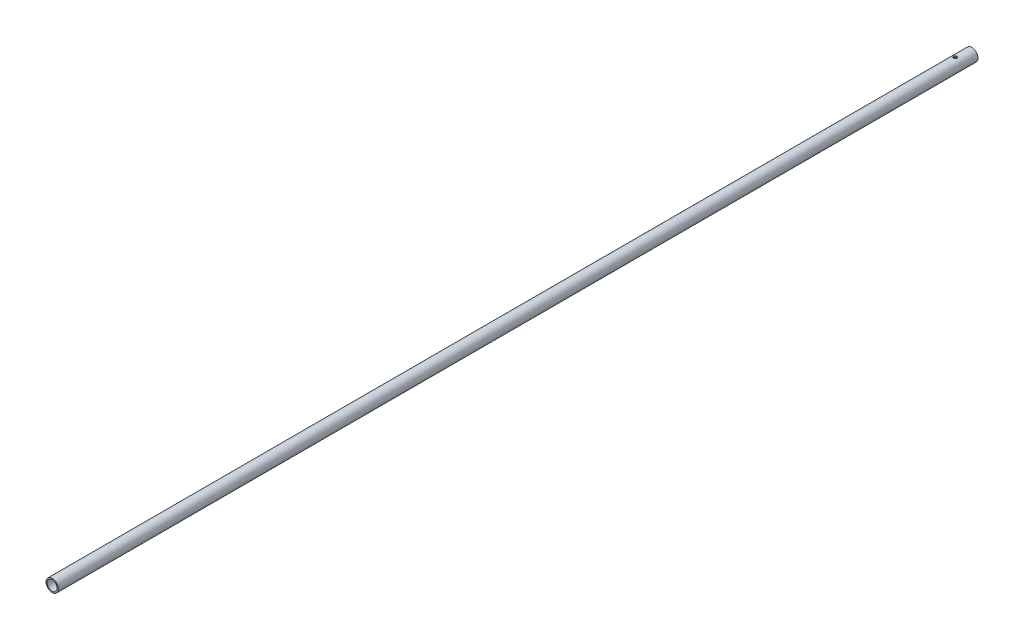
ISO-10303-21;
HEADER;
FILE_DESCRIPTION(('STEP AP214'),'2;1');
FILE_NAME('part.step','',(''),(''),'','','');
FILE_SCHEMA(('AUTOMOTIVE_DESIGN { 1 0 10303 214 1 1 1 1 }'));
ENDSEC;
DATA;
#1=APPLICATION_CONTEXT('core data for automotive mechanical design processes');
#2=APPLICATION_PROTOCOL_DEFINITION('international standard','automotive_design',2000,#1);
#3=PRODUCT_CONTEXT('',#1,'mechanical');
#4=PRODUCT('Part','Part','',(#3));
#5=PRODUCT_RELATED_PRODUCT_CATEGORY('part','',(#4));
#6=PRODUCT_DEFINITION_FORMATION('','',#4);
#7=PRODUCT_DEFINITION_CONTEXT('part definition',#1,'design');
#8=PRODUCT_DEFINITION('design','',#6,#7);
#9=PRODUCT_DEFINITION_SHAPE('','',#8);
#10=(LENGTH_UNIT() NAMED_UNIT(*) SI_UNIT(.MILLI.,.METRE.));
#11=(NAMED_UNIT(*) PLANE_ANGLE_UNIT() SI_UNIT($,.RADIAN.));
#12=(NAMED_UNIT(*) SI_UNIT($,.STERADIAN.) SOLID_ANGLE_UNIT());
#13=UNCERTAINTY_MEASURE_WITH_UNIT(LENGTH_MEASURE(1.E-05),#10,'distance_accuracy_value','');
#14=(GEOMETRIC_REPRESENTATION_CONTEXT(3) GLOBAL_UNCERTAINTY_ASSIGNED_CONTEXT((#13)) GLOBAL_UNIT_ASSIGNED_CONTEXT((#10,
#11,#12)) REPRESENTATION_CONTEXT('',''));
#15=CARTESIAN_POINT('',(0.,0.,0.));
#16=DIRECTION('',(0.,0.,1.));
#17=DIRECTION('',(1.,0.,0.));
#18=AXIS2_PLACEMENT_3D('',#15,#16,#17);
#19=CARTESIAN_POINT('',(0.,0.,558.8));
#20=DIRECTION('',(0.,0.,1.));
#21=DIRECTION('',(1.,0.,0.));
#22=AXIS2_PLACEMENT_3D('',#19,#20,#21);
#23=PLANE('',#22);
#24=CARTESIAN_POINT('',(0.,0.,558.8));
#25=DIRECTION('',(0.,0.,1.));
#26=DIRECTION('',(1.,0.,0.));
#27=AXIS2_PLACEMENT_3D('',#24,#25,#26);
#28=CIRCLE('',#27,3.7592);
#29=CARTESIAN_POINT('',(3.7592,0.,558.8));
#30=VERTEX_POINT('',#29);
#31=EDGE_CURVE('E10',#30,#30,#28,.T.);
#32=ORIENTED_EDGE('',*,*,#31,.T.);
#33=EDGE_LOOP('',(#32));
#34=FACE_BOUND('',#33,.T.);
#35=CARTESIAN_POINT('',(0.,0.,558.8));
#36=DIRECTION('',(0.,0.,1.));
#37=DIRECTION('',(1.,0.,0.));
#38=AXIS2_PLACEMENT_3D('',#35,#36,#37);
#39=CIRCLE('',#38,3.048);
#40=CARTESIAN_POINT('',(3.048,0.,558.8));
#41=VERTEX_POINT('',#40);
#42=EDGE_CURVE('E49',#41,#41,#39,.T.);
#43=ORIENTED_EDGE('',*,*,#42,.F.);
#44=EDGE_LOOP('',(#43));
#45=FACE_BOUND('',#44,.T.);
#46=ADVANCED_FACE('F32',(#34,#45),#23,.T.);
#47=CARTESIAN_POINT('',(0.,0.,0.));
#48=DIRECTION('',(0.,0.,1.));
#49=DIRECTION('',(1.,0.,0.));
#50=AXIS2_PLACEMENT_3D('',#47,#48,#49);
#51=PLANE('',#50);
#52=CARTESIAN_POINT('',(0.,0.,0.));
#53=DIRECTION('',(0.,0.,1.));
#54=DIRECTION('',(1.,0.,0.));
#55=AXIS2_PLACEMENT_3D('',#52,#53,#54);
#56=CIRCLE('',#55,3.7592);
#57=CARTESIAN_POINT('',(3.7592,0.,0.));
#58=VERTEX_POINT('',#57);
#59=EDGE_CURVE('E44',#58,#58,#56,.T.);
#60=ORIENTED_EDGE('',*,*,#59,.F.);
#61=EDGE_LOOP('',(#60));
#62=FACE_BOUND('',#61,.T.);
#63=CARTESIAN_POINT('',(0.,0.,0.));
#64=DIRECTION('',(0.,0.,1.));
#65=DIRECTION('',(1.,0.,0.));
#66=AXIS2_PLACEMENT_3D('',#63,#64,#65);
#67=CIRCLE('',#66,3.048);
#68=CARTESIAN_POINT('',(3.048,0.,0.));
#69=VERTEX_POINT('',#68);
#70=EDGE_CURVE('E52',#69,#69,#67,.T.);
#71=ORIENTED_EDGE('',*,*,#70,.T.);
#72=EDGE_LOOP('',(#71));
#73=FACE_BOUND('',#72,.T.);
#74=ADVANCED_FACE('F103',(#62,#73),#51,.F.);
#75=CARTESIAN_POINT('',(0.,0.,558.8));
#76=DIRECTION('',(0.,0.,-1.));
#77=DIRECTION('',(-1.,0.,0.));
#78=AXIS2_PLACEMENT_3D('',#75,#76,#77);
#79=CYLINDRICAL_SURFACE('',#78,3.7592);
#80=CARTESIAN_POINT('',(0.,-3.7592,11.176));
#81=CARTESIAN_POINT('',(-0.055981236537999,-3.75919918459358,11.1759987302058));
#82=CARTESIAN_POINT('',(-0.111975966663057,-3.75793723752587,11.1713576840597));
#83=CARTESIAN_POINT('',(-0.222350551239019,-3.75302570635412,11.1529501221138));
#84=CARTESIAN_POINT('',(-0.276729647185963,-3.7493750187443,11.1391793887126));
#85=CARTESIAN_POINT('',(-0.382263937320672,-3.74008864799323,11.1029942403726));
#86=CARTESIAN_POINT('',(-0.433423249592395,-3.7344555637542,11.0805911387505));
#87=CARTESIAN_POINT('',(-0.531258572775888,-3.72179869306041,11.0278196031624));
#88=CARTESIAN_POINT('',(-0.577934252422427,-3.7147748039657,10.9974505812661));
#89=CARTESIAN_POINT('',(-0.666586464597382,-3.69990710084376,10.9288475177812));
#90=CARTESIAN_POINT('',(-0.708441284490966,-3.69204897451998,10.890459292945));
#91=CARTESIAN_POINT('',(-0.78520421892341,-3.6764896642834,10.8072370125901));
#92=CARTESIAN_POINT('',(-0.820111413146418,-3.66878850128383,10.7624021044659));
#93=CARTESIAN_POINT('',(-0.88258643458332,-3.65426817166658,10.6665816695557));
#94=CARTESIAN_POINT('',(-0.910013368423057,-3.64746703588247,10.6155012962732));
#95=CARTESIAN_POINT('',(-0.955841492406535,-3.63572760673628,10.5092406741372));
#96=CARTESIAN_POINT('',(-0.974244397263731,-3.63078895951206,10.4540612064751));
#97=CARTESIAN_POINT('',(-1.00107769578693,-3.62348158996868,10.3425187366869));
#98=CARTESIAN_POINT('',(-1.00972915859465,-3.62105600315438,10.2862127331933));
#99=CARTESIAN_POINT('',(-1.01750333065012,-3.61887956381147,10.1729002965618));
#100=CARTESIAN_POINT('',(-1.01662787293595,-3.61912819674645,10.1158940002727));
#101=CARTESIAN_POINT('',(-1.00554836762721,-3.62222126178157,10.0045318773362));
#102=CARTESIAN_POINT('',(-0.995612761546391,-3.62499099246598,9.95014693705533));
#103=CARTESIAN_POINT('',(-0.967125325284436,-3.63269443532542,9.84384621638498));
#104=CARTESIAN_POINT('',(-0.948572789792825,-3.63762832463871,9.7919306385006));
#105=CARTESIAN_POINT('',(-0.903161597565696,-3.64916921080514,9.69134708207385));
#106=CARTESIAN_POINT('',(-0.876209566697004,-3.65579485671458,9.64272349008686));
#107=CARTESIAN_POINT('',(-0.814829563328908,-3.66996279833399,9.55059525008809));
#108=CARTESIAN_POINT('',(-0.780400083193257,-3.67750527876493,9.50709163712045));
#109=CARTESIAN_POINT('',(-0.703673983133144,-3.69296717341038,9.42490563926336));
#110=CARTESIAN_POINT('',(-0.661152200636483,-3.70089074452404,9.38643393805576));
#111=CARTESIAN_POINT('',(-0.570163403782982,-3.71599542438007,9.31712370840479));
#112=CARTESIAN_POINT('',(-0.521696142451035,-3.72317650225642,9.28628549721718));
#113=CARTESIAN_POINT('',(-0.419860142806302,-3.73603326449054,9.23302135263665));
#114=CARTESIAN_POINT('',(-0.366470058875214,-3.74170193398508,9.2106344257161));
#115=CARTESIAN_POINT('',(-0.25649571502604,-3.75084450946339,9.17521520646203));
#116=CARTESIAN_POINT('',(-0.199912175802817,-3.75431890850678,9.16218081249469));
#117=CARTESIAN_POINT('',(-0.0869544099686766,-3.75860655224015,9.14616949808162));
#118=CARTESIAN_POINT('',(-0.0306235848601433,-3.75949553932608,9.14290623477879));
#119=CARTESIAN_POINT('',(0.0817807641836961,-3.75873041519249,9.14573782813204));
#120=CARTESIAN_POINT('',(0.137854314856597,-3.75707657453267,9.15183168917951));
#121=CARTESIAN_POINT('',(0.247124350408283,-3.75146062225681,9.17296998072428));
#122=CARTESIAN_POINT('',(0.300354207740429,-3.74753992679453,9.18785391578566));
#123=CARTESIAN_POINT('',(0.403555769322896,-3.73783576886523,9.22596279176762));
#124=CARTESIAN_POINT('',(0.453527114981151,-3.73205210179687,9.24918864887422));
#125=CARTESIAN_POINT('',(0.549899746962868,-3.71908701315947,9.3038479264627));
#126=CARTESIAN_POINT('',(0.596209736414399,-3.71187996941981,9.33543608648639));
#127=CARTESIAN_POINT('',(0.682971949357936,-3.69690081938352,9.40572946516984));
#128=CARTESIAN_POINT('',(0.72342298023362,-3.68912859852493,9.44443612920261));
#129=CARTESIAN_POINT('',(0.798531413525871,-3.67361509832816,9.52920529933542));
#130=CARTESIAN_POINT('',(0.832986565583012,-3.66588126550813,9.57544870801438));
#131=CARTESIAN_POINT('',(0.893653131776007,-3.65156732786377,9.67322531192282));
#132=CARTESIAN_POINT('',(0.919864881886327,-3.64498717602396,9.72475829145288));
#133=CARTESIAN_POINT('',(0.963103749968263,-3.63380171154526,9.83140059016736));
#134=CARTESIAN_POINT('',(0.980183439919998,-3.62918512709987,9.8864873470279));
#135=CARTESIAN_POINT('',(1.00479357694007,-3.62244950359569,9.99889760081478));
#136=CARTESIAN_POINT('',(1.01232654574886,-3.62032980500172,10.0562205029439));
#137=CARTESIAN_POINT('',(1.01748148630745,-3.61888410126251,10.1694022584618));
#138=CARTESIAN_POINT('',(1.01542896653059,-3.61946633821143,10.2252453331702));
#139=CARTESIAN_POINT('',(1.00222851810503,-3.62314347093249,10.3357573114387));
#140=CARTESIAN_POINT('',(0.991080835716672,-3.62623829867378,10.3904262467485));
#141=CARTESIAN_POINT('',(0.960197567364567,-3.6345365373973,10.4966158861889));
#142=CARTESIAN_POINT('',(0.940532727089865,-3.639722554458,10.5481586207124));
#143=CARTESIAN_POINT('',(0.893228205610188,-3.65161884500594,10.6472526209846));
#144=CARTESIAN_POINT('',(0.865587242600697,-3.6583293634516,10.6948032435931));
#145=CARTESIAN_POINT('',(0.80213609548457,-3.6727713850916,10.7861125981675));
#146=CARTESIAN_POINT('',(0.76610463515918,-3.68052758048504,10.8297136771453));
#147=CARTESIAN_POINT('',(0.687313790569808,-3.69605112772039,10.9103563493302));
#148=CARTESIAN_POINT('',(0.644552762864312,-3.70381848182706,10.9473963355303));
#149=CARTESIAN_POINT('',(0.552373591230194,-3.71869502650103,11.0146733487932));
#150=CARTESIAN_POINT('',(0.502828945877775,-3.72578582247295,11.0447414718785));
#151=CARTESIAN_POINT('',(0.399197708452166,-3.73830732319349,11.0960748065036));
#152=CARTESIAN_POINT('',(0.345113977900662,-3.74373906396721,11.1173455146892));
#153=CARTESIAN_POINT('',(0.242713771472098,-3.75165100474649,11.1477932328077));
#154=CARTESIAN_POINT('',(0.194827335938966,-3.75446097462085,11.158345803178));
#155=CARTESIAN_POINT('',(0.0979639679997302,-3.75823573245692,11.1724493759623));
#156=CARTESIAN_POINT('',(0.0489871502662704,-3.75920071353259,11.1760011111509));
#157=CARTESIAN_POINT('',(0.,-3.7592,11.176));
#158=B_SPLINE_CURVE_WITH_KNOTS('',3,(#80,#81,#82,#83,#84,#85,#86,#87,#88,#89,#90,#91,#92,#93,
#94,#95,#96,#97,#98,#99,#100,#101,#102,#103,#104,#105,#106,#107,#108,#109,#110,#111,#112,#113,
#114,#115,#116,#117,#118,#119,#120,#121,#122,#123,#124,#125,#126,#127,#128,#129,#130,#131,#132,
#133,#134,#135,#136,#137,#138,#139,#140,#141,#142,#143,#144,#145,#146,#147,#148,#149,#150,#151,
#152,#153,#154,#155,#156,#157),.UNSPECIFIED.,.T.,.F.,(4,2,2,2,2,2,2,2,2,2,2,2,2,2,2,2,2,2,2,2,2,
2,2,2,2,2,2,2,2,2,2,2,2,2,2,2,2,2,4),(0.,0.167764031572985,0.335605618411471,0.503227981307256,
0.670862719173472,0.842079214270509,1.01331837445387,1.1875894762668,1.36182745086884,
1.53203051652779,1.70220083465,1.867487448289,2.03278759330612,2.19999513759468,
2.36723642635468,2.54008787610885,2.71294650854284,2.8865934806939,3.06020141991774,
3.22866940768012,3.39711947150031,3.56258500663269,3.72806872026043,3.89685934856243,
4.06568428678518,4.23940962382628,4.41312787946532,4.58583499163804,4.75849647418137,
4.92533810814797,5.0921752248656,5.25765235620304,5.42315609540265,5.59365232945826,
5.76419026554736,5.93850654154566,6.11271373918457,6.25953332861178,6.40633754967187),.UNSPECIFIED.);
#159=CARTESIAN_POINT('',(0.,-3.7592,11.176));
#160=VERTEX_POINT('',#159);
#161=EDGE_CURVE('E58',#160,#160,#158,.T.);
#162=ORIENTED_EDGE('',*,*,#161,.F.);
#163=EDGE_LOOP('',(#162));
#164=FACE_BOUND('',#163,.T.);
#165=CARTESIAN_POINT('',(0.,3.7592,9.144));
#166=CARTESIAN_POINT('',(0.055981236537999,3.75919918459358,9.14400126979425));
#167=CARTESIAN_POINT('',(0.111975966663057,3.75793723752587,9.14864231594031));
#168=CARTESIAN_POINT('',(0.222350551239019,3.75302570635412,9.16704987788616));
#169=CARTESIAN_POINT('',(0.276729647185963,3.7493750187443,9.18082061128741));
#170=CARTESIAN_POINT('',(0.382263937320672,3.74008864799323,9.21700575962737));
#171=CARTESIAN_POINT('',(0.433423249592395,3.7344555637542,9.23940886124951));
#172=CARTESIAN_POINT('',(0.531258572775888,3.72179869306041,9.29218039683759));
#173=CARTESIAN_POINT('',(0.577934252422427,3.7147748039657,9.32254941873395));
#174=CARTESIAN_POINT('',(0.666586464597382,3.69990710084376,9.3911524822188));
#175=CARTESIAN_POINT('',(0.708441284490965,3.69204897451998,9.42954070705504));
#176=CARTESIAN_POINT('',(0.78520421892341,3.6764896642834,9.51276298740994));
#177=CARTESIAN_POINT('',(0.820111413146418,3.66878850128383,9.55759789553414));
#178=CARTESIAN_POINT('',(0.88258643458332,3.65426817166658,9.65341833044435));
#179=CARTESIAN_POINT('',(0.910013368423057,3.64746703588247,9.70449870372676));
#180=CARTESIAN_POINT('',(0.955841492406535,3.63572760673629,9.81075932586279));
#181=CARTESIAN_POINT('',(0.974244397263731,3.63078895951206,9.8659387935249));
#182=CARTESIAN_POINT('',(1.00107769578693,3.62348158996868,9.97748126331312));
#183=CARTESIAN_POINT('',(1.00972915859465,3.62105600315438,10.0337872668067));
#184=CARTESIAN_POINT('',(1.01750333065012,3.61887956381147,10.1470997034382));
#185=CARTESIAN_POINT('',(1.01662787293595,3.61912819674645,10.2041059997273));
#186=CARTESIAN_POINT('',(1.00554836762721,3.62222126178157,10.3154681226638));
#187=CARTESIAN_POINT('',(0.995612761546391,3.62499099246598,10.3698530629447));
#188=CARTESIAN_POINT('',(0.967125325284436,3.63269443532542,10.476153783615));
#189=CARTESIAN_POINT('',(0.948572789792825,3.63762832463871,10.5280693614994));
#190=CARTESIAN_POINT('',(0.903161597565696,3.64916921080514,10.6286529179262));
#191=CARTESIAN_POINT('',(0.876209566697004,3.65579485671458,10.6772765099131));
#192=CARTESIAN_POINT('',(0.814829563328908,3.66996279833399,10.7694047499119));
#193=CARTESIAN_POINT('',(0.780400083193257,3.67750527876493,10.8129083628796));
#194=CARTESIAN_POINT('',(0.703673983133144,3.69296717341038,10.8950943607366));
#195=CARTESIAN_POINT('',(0.661152200636483,3.70089074452404,10.9335660619442));
#196=CARTESIAN_POINT('',(0.570163403782982,3.71599542438007,11.0028762915952));
#197=CARTESIAN_POINT('',(0.521696142451035,3.72317650225642,11.0337145027828));
#198=CARTESIAN_POINT('',(0.419860142806301,3.73603326449054,11.0869786473634));
#199=CARTESIAN_POINT('',(0.366470058875213,3.74170193398508,11.1093655742839));
#200=CARTESIAN_POINT('',(0.256495715026039,3.75084450946339,11.144784793538));
#201=CARTESIAN_POINT('',(0.199912175802817,3.75431890850678,11.1578191875053));
#202=CARTESIAN_POINT('',(0.0869544099686766,3.75860655224015,11.1738305019184));
#203=CARTESIAN_POINT('',(0.0306235848601433,3.75949553932608,11.1770937652212));
#204=CARTESIAN_POINT('',(-0.0817807641836961,3.75873041519249,11.174262171868));
#205=CARTESIAN_POINT('',(-0.137854314856597,3.75707657453267,11.1681683108205));
#206=CARTESIAN_POINT('',(-0.247124350408283,3.75146062225681,11.1470300192757));
#207=CARTESIAN_POINT('',(-0.300354207740429,3.74753992679453,11.1321460842143));
#208=CARTESIAN_POINT('',(-0.403555769322896,3.73783576886523,11.0940372082324));
#209=CARTESIAN_POINT('',(-0.453527114981151,3.73205210179687,11.0708113511258));
#210=CARTESIAN_POINT('',(-0.549899746962868,3.71908701315947,11.0161520735373));
#211=CARTESIAN_POINT('',(-0.596209736414398,3.71187996941981,10.9845639135136));
#212=CARTESIAN_POINT('',(-0.682971949357936,3.69690081938352,10.9142705348302));
#213=CARTESIAN_POINT('',(-0.72342298023362,3.68912859852493,10.8755638707974));
#214=CARTESIAN_POINT('',(-0.798531413525871,3.67361509832816,10.7907947006646));
#215=CARTESIAN_POINT('',(-0.832986565583011,3.66588126550813,10.7445512919856));
#216=CARTESIAN_POINT('',(-0.893653131776007,3.65156732786377,10.6467746880772));
#217=CARTESIAN_POINT('',(-0.919864881886327,3.64498717602396,10.5952417085471));
#218=CARTESIAN_POINT('',(-0.963103749968263,3.63380171154526,10.4885994098326));
#219=CARTESIAN_POINT('',(-0.980183439919998,3.62918512709987,10.4335126529721));
#220=CARTESIAN_POINT('',(-1.00479357694007,3.62244950359569,10.3211023991852));
#221=CARTESIAN_POINT('',(-1.01232654574886,3.62032980500172,10.2637794970561));
#222=CARTESIAN_POINT('',(-1.01748148630745,3.61888410126251,10.1505977415382));
#223=CARTESIAN_POINT('',(-1.01542896653059,3.61946633821143,10.0947546668298));
#224=CARTESIAN_POINT('',(-1.00222851810503,3.62314347093249,9.98424268856133));
#225=CARTESIAN_POINT('',(-0.991080835716672,3.62623829867378,9.92957375325147));
#226=CARTESIAN_POINT('',(-0.960197567364567,3.6345365373973,9.82338411381113));
#227=CARTESIAN_POINT('',(-0.940532727089865,3.639722554458,9.77184137928755));
#228=CARTESIAN_POINT('',(-0.893228205610188,3.65161884500594,9.67274737901541));
#229=CARTESIAN_POINT('',(-0.865587242600697,3.6583293634516,9.6251967564069));
#230=CARTESIAN_POINT('',(-0.80213609548457,3.6727713850916,9.53388740183251));
#231=CARTESIAN_POINT('',(-0.76610463515918,3.68052758048504,9.4902863228547));
#232=CARTESIAN_POINT('',(-0.687313790569808,3.69605112772039,9.40964365066985));
#233=CARTESIAN_POINT('',(-0.644552762864313,3.70381848182706,9.37260366446972));
#234=CARTESIAN_POINT('',(-0.552373591230194,3.71869502650103,9.30532665120681));
#235=CARTESIAN_POINT('',(-0.502828945877775,3.72578582247295,9.27525852812151));
#236=CARTESIAN_POINT('',(-0.399197708452166,3.73830732319349,9.22392519349641));
#237=CARTESIAN_POINT('',(-0.345113977900662,3.74373906396721,9.20265448531079));
#238=CARTESIAN_POINT('',(-0.242713771472098,3.75165100474649,9.17220676719232));
#239=CARTESIAN_POINT('',(-0.194827335938966,3.75446097462085,9.16165419682196));
#240=CARTESIAN_POINT('',(-0.0979639679997302,3.75823573245692,9.14755062403774));
#241=CARTESIAN_POINT('',(-0.0489871502662704,3.75920071353259,9.1439988888491));
#242=CARTESIAN_POINT('',(0.,3.7592,9.144));
#243=B_SPLINE_CURVE_WITH_KNOTS('',3,(#165,#166,#167,#168,#169,#170,#171,#172,#173,#174,#175,
#176,#177,#178,#179,#180,#181,#182,#183,#184,#185,#186,#187,#188,#189,#190,#191,#192,#193,#194,
#195,#196,#197,#198,#199,#200,#201,#202,#203,#204,#205,#206,#207,#208,#209,#210,#211,#212,#213,
#214,#215,#216,#217,#218,#219,#220,#221,#222,#223,#224,#225,#226,#227,#228,#229,#230,#231,#232,
#233,#234,#235,#236,#237,#238,#239,#240,#241,#242),.UNSPECIFIED.,.T.,.F.,(4,2,2,2,2,2,2,2,2,2,2,
2,2,2,2,2,2,2,2,2,2,2,2,2,2,2,2,2,2,2,2,2,2,2,2,2,2,2,4),(0.,0.167764031572985,
0.335605618411471,0.503227981307256,0.670862719173472,0.842079214270508,1.01331837445387,
1.1875894762668,1.36182745086884,1.53203051652779,1.70220083465,1.867487448289,2.03278759330612,
2.19999513759468,2.36723642635468,2.54008787610885,2.71294650854284,2.8865934806939,
3.06020141991774,3.22866940768012,3.39711947150031,3.56258500663269,3.72806872026043,
3.89685934856243,4.06568428678518,4.23940962382628,4.41312787946532,4.58583499163804,
4.75849647418137,4.92533810814797,5.0921752248656,5.25765235620304,5.42315609540265,
5.59365232945826,5.76419026554736,5.93850654154566,6.11271373918457,6.25953332861179,
6.40633754967187),.UNSPECIFIED.);
#244=CARTESIAN_POINT('',(0.,3.7592,9.144));
#245=VERTEX_POINT('',#244);
#246=EDGE_CURVE('E79',#245,#245,#243,.T.);
#247=ORIENTED_EDGE('',*,*,#246,.T.);
#248=EDGE_LOOP('',(#247));
#249=FACE_BOUND('',#248,.T.);
#250=ORIENTED_EDGE('',*,*,#31,.F.);
#251=EDGE_LOOP('',(#250));
#252=FACE_BOUND('',#251,.T.);
#253=ORIENTED_EDGE('',*,*,#59,.T.);
#254=EDGE_LOOP('',(#253));
#255=FACE_BOUND('',#254,.T.);
#256=ADVANCED_FACE('F34',(#164,#249,#252,#255),#79,.T.);
#257=CARTESIAN_POINT('',(0.,0.,558.8));
#258=DIRECTION('',(0.,0.,-1.));
#259=DIRECTION('',(-1.,0.,0.));
#260=AXIS2_PLACEMENT_3D('',#257,#258,#259);
#261=CYLINDRICAL_SURFACE('',#260,3.048);
#262=CARTESIAN_POINT('',(0.,-3.048,11.176));
#263=CARTESIAN_POINT('',(0.0554363766929108,-3.04800015545758,11.1760002577913));
#264=CARTESIAN_POINT('',(0.110871197651167,-3.04647365819665,11.1714480496147));
#265=CARTESIAN_POINT('',(0.22010802904694,-3.04053453566533,11.1534152254417));
#266=CARTESIAN_POINT('',(0.273909869368719,-3.03612161077387,11.1399336825479));
#267=CARTESIAN_POINT('',(0.378290114133804,-3.02488912832946,11.1045556487218));
#268=CARTESIAN_POINT('',(0.42887374310021,-3.01807359534547,11.0826732245414));
#269=CARTESIAN_POINT('',(0.525652935794209,-3.00273156848819,11.0311781683962));
#270=CARTESIAN_POINT('',(0.571847631470044,-2.99420473718462,11.0015640115574));
#271=CARTESIAN_POINT('',(0.660137541822622,-2.97600719954093,10.9343689822635));
#272=CARTESIAN_POINT('',(0.702059759503082,-2.96630909367205,10.8965682659913));
#273=CARTESIAN_POINT('',(0.779102015785317,-2.94701279819651,10.8145405708181));
#274=CARTESIAN_POINT('',(0.814220556457293,-2.93741463103198,10.7703121805126));
#275=CARTESIAN_POINT('',(0.877646141303504,-2.9191034579691,10.6751271229604));
#276=CARTESIAN_POINT('',(0.905728295952568,-2.91042383904099,10.6240135604322));
#277=CARTESIAN_POINT('',(0.952823975859764,-2.89534910305299,10.5174530880301));
#278=CARTESIAN_POINT('',(0.971840268544952,-2.88895328899317,10.4620075065627));
#279=CARTESIAN_POINT('',(0.99961543689331,-2.87945884121687,10.3503240069593));
#280=CARTESIAN_POINT('',(1.00869846344412,-2.87625633301925,10.2941757961751));
#281=CARTESIAN_POINT('',(1.01736258130783,-2.8732038713558,10.1810680257776));
#282=CARTESIAN_POINT('',(1.01694660883039,-2.87335288191094,10.1241087223195));
#283=CARTESIAN_POINT('',(1.00687622216267,-2.87689559248311,10.0137603834689));
#284=CARTESIAN_POINT('',(0.997644855777667,-2.88014070521413,9.96032714263428));
#285=CARTESIAN_POINT('',(0.970895861455008,-2.88926684248144,9.85581628567946));
#286=CARTESIAN_POINT('',(0.953377241417341,-2.89514818260653,9.80473895239797));
#287=CARTESIAN_POINT('',(0.910274082989175,-2.90898997709349,9.70542864641506));
#288=CARTESIAN_POINT('',(0.884564193486579,-2.91698238845807,9.65725472612296));
#289=CARTESIAN_POINT('',(0.82589533200399,-2.93413239512938,9.5657711571878));
#290=CARTESIAN_POINT('',(0.79293426616183,-2.94329032667111,9.52246291903569));
#291=CARTESIAN_POINT('',(0.718666922005154,-2.96232406434425,9.43956293626866));
#292=CARTESIAN_POINT('',(0.677014800477533,-2.9722123878452,9.40028326237879));
#293=CARTESIAN_POINT('',(0.587593003089586,-2.99117449401229,9.32918503306999));
#294=CARTESIAN_POINT('',(0.539822741191389,-3.00024819850676,9.29736719322487));
#295=CARTESIAN_POINT('',(0.438858774855009,-3.01667781664798,9.24184455896117));
#296=CARTESIAN_POINT('',(0.385615968838999,-3.02401579608168,9.21822338079782));
#297=CARTESIAN_POINT('',(0.27560938869834,-3.03601696218746,9.180369575261));
#298=CARTESIAN_POINT('',(0.218846845165433,-3.04068107793357,9.16613368656979));
#299=CARTESIAN_POINT('',(0.106053970801773,-3.04665509104584,9.14800744332128));
#300=CARTESIAN_POINT('',(0.0500985534626832,-3.0481016186307,9.14369539388049));
#301=CARTESIAN_POINT('',(-0.0617474710795996,-3.04788725137942,9.14433799637604));
#302=CARTESIAN_POINT('',(-0.11763808762876,-3.04622688106062,9.14929108413955));
#303=CARTESIAN_POINT('',(-0.226080184165126,-3.04007545112588,9.16798969825974));
#304=CARTESIAN_POINT('',(-0.278681491744213,-3.03566777890608,9.18147638534632));
#305=CARTESIAN_POINT('',(-0.380853653916833,-3.02454916379315,9.21653573957817));
#306=CARTESIAN_POINT('',(-0.430424121124696,-3.01783792719286,9.23810943785916));
#307=CARTESIAN_POINT('',(-0.526580909135614,-3.00257394188026,9.28935955875035));
#308=CARTESIAN_POINT('',(-0.573054438564806,-2.99397739792406,9.31923418677614));
#309=CARTESIAN_POINT('',(-0.660465867417569,-2.97591737978395,9.38600525641326));
#310=CARTESIAN_POINT('',(-0.701402069679611,-2.96645364129358,9.42290384252664));
#311=CARTESIAN_POINT('',(-0.778512547931925,-2.94718077550192,9.50465841102439));
#312=CARTESIAN_POINT('',(-0.814385944756466,-2.93737549272678,9.54979977456418));
#313=CARTESIAN_POINT('',(-0.878085642677986,-2.91896772859573,9.64567191288937));
#314=CARTESIAN_POINT('',(-0.905911876687576,-2.9103652572677,9.69640273426797));
#315=CARTESIAN_POINT('',(-0.952598481310134,-2.89542110089433,9.8020357835515));
#316=CARTESIAN_POINT('',(-0.97147698231293,-2.88907485075042,9.85692931251066));
#317=CARTESIAN_POINT('',(-0.999636981460837,-2.87945405717519,9.96937670852614));
#318=CARTESIAN_POINT('',(-1.00892280304062,-2.87617813000661,10.02692936488));
#319=CARTESIAN_POINT('',(-1.0172967029899,-2.87322624617072,10.1398802495494));
#320=CARTESIAN_POINT('',(-1.0168841814279,-2.87337398749808,10.1952372576958));
#321=CARTESIAN_POINT('',(-1.00710217015016,-2.87681690242337,10.3050493160981));
#322=CARTESIAN_POINT('',(-0.997733213530229,-2.88011188869418,10.3595044198402));
#323=CARTESIAN_POINT('',(-0.970657762137013,-2.88934676667406,10.4649378336209));
#324=CARTESIAN_POINT('',(-0.953112999551118,-2.89523523583762,10.5159625342073));
#325=CARTESIAN_POINT('',(-0.910315035612548,-2.9089746120664,10.6143830454465));
#326=CARTESIAN_POINT('',(-0.885060123250843,-2.91682595465541,10.6617780476863));
#327=CARTESIAN_POINT('',(-0.826272863664581,-2.93403354491645,10.7538354086425));
#328=CARTESIAN_POINT('',(-0.792427414648765,-2.9434405102787,10.798288285929));
#329=CARTESIAN_POINT('',(-0.717949169265869,-2.96248689984327,10.8810448503981));
#330=CARTESIAN_POINT('',(-0.67731445380272,-2.97212638911118,10.919346792899));
#331=CARTESIAN_POINT('',(-0.588509421831407,-2.99100271013799,10.9902187228859));
#332=CARTESIAN_POINT('',(-0.540107137715723,-3.00020920710036,11.022507137315));
#333=CARTESIAN_POINT('',(-0.438259075125137,-3.01676807031415,11.0784542757122));
#334=CARTESIAN_POINT('',(-0.384814590422469,-3.02412091042467,11.1021152058568));
#335=CARTESIAN_POINT('',(-0.276853545556192,-3.03586403309628,11.1391411786085));
#336=CARTESIAN_POINT('',(-0.222491561799232,-3.0403719982128,11.1529189857236));
#337=CARTESIAN_POINT('',(-0.112085542666412,-3.04643949577252,11.171347005168));
#338=CARTESIAN_POINT('',(-0.0560419763778468,-3.04799984284416,11.1759997393925));
#339=CARTESIAN_POINT('',(0.,-3.048,11.176));
#340=B_SPLINE_CURVE_WITH_KNOTS('',3,(#262,#263,#264,#265,#266,#267,#268,#269,#270,#271,#272,
#273,#274,#275,#276,#277,#278,#279,#280,#281,#282,#283,#284,#285,#286,#287,#288,#289,#290,#291,
#292,#293,#294,#295,#296,#297,#298,#299,#300,#301,#302,#303,#304,#305,#306,#307,#308,#309,#310,
#311,#312,#313,#314,#315,#316,#317,#318,#319,#320,#321,#322,#323,#324,#325,#326,#327,#328,#329,
#330,#331,#332,#333,#334,#335,#336,#337,#338,#339),.UNSPECIFIED.,.T.,.F.,(4,2,2,2,2,2,2,2,2,2,2,
2,2,2,2,2,2,2,2,2,2,2,2,2,2,2,2,2,2,2,2,2,2,2,2,2,2,2,4),(0.,0.166102899722427,0.3322230442318,
0.498066235636197,0.663942159843885,0.834996392312799,1.00608824220131,1.18209958980646,
1.35805717407918,1.5280835655371,1.69805740131285,1.86026375776101,2.02248953749169,
2.18732781893613,2.35221376199138,2.52570798704349,2.69921884302084,2.87445100140763,
3.04962223579244,3.21720040505972,3.38475028574803,3.54744688505865,3.71016423608649,
3.87716166241236,4.04421015715041,4.21884879246844,4.39348888366757,4.56777358045607,
4.74197969256059,4.90723596713524,5.07248240610644,5.23459036463351,5.3967343237644,
5.56595347748521,5.73522054491406,5.91108455398109,6.08690356040543,6.25486743297442,
6.42278487884397),.UNSPECIFIED.);
#341=CARTESIAN_POINT('',(0.,-3.048,11.176));
#342=VERTEX_POINT('',#341);
#343=EDGE_CURVE('E36',#342,#342,#340,.T.);
#344=ORIENTED_EDGE('',*,*,#343,.F.);
#345=EDGE_LOOP('',(#344));
#346=FACE_BOUND('',#345,.T.);
#347=CARTESIAN_POINT('',(0.,3.048,11.176));
#348=CARTESIAN_POINT('',(-0.0554363766929109,3.04800015545758,11.1760002577913));
#349=CARTESIAN_POINT('',(-0.110871197651167,3.04647365819665,11.1714480496147));
#350=CARTESIAN_POINT('',(-0.22010802904694,3.04053453566533,11.1534152254417));
#351=CARTESIAN_POINT('',(-0.273909869368719,3.03612161077387,11.1399336825479));
#352=CARTESIAN_POINT('',(-0.378290114133805,3.02488912832946,11.1045556487218));
#353=CARTESIAN_POINT('',(-0.428873743100211,3.01807359534547,11.0826732245414));
#354=CARTESIAN_POINT('',(-0.52565293579421,3.00273156848819,11.0311781683962));
#355=CARTESIAN_POINT('',(-0.571847631470045,2.99420473718462,11.0015640115574));
#356=CARTESIAN_POINT('',(-0.660137541822622,2.97600719954093,10.9343689822635));
#357=CARTESIAN_POINT('',(-0.702059759503082,2.96630909367205,10.8965682659913));
#358=CARTESIAN_POINT('',(-0.779102015785317,2.94701279819651,10.8145405708181));
#359=CARTESIAN_POINT('',(-0.814220556457294,2.93741463103198,10.7703121805126));
#360=CARTESIAN_POINT('',(-0.877646141303505,2.9191034579691,10.6751271229604));
#361=CARTESIAN_POINT('',(-0.905728295952569,2.91042383904099,10.6240135604322));
#362=CARTESIAN_POINT('',(-0.952823975859765,2.89534910305299,10.5174530880301));
#363=CARTESIAN_POINT('',(-0.971840268544953,2.88895328899317,10.4620075065627));
#364=CARTESIAN_POINT('',(-0.99961543689331,2.87945884121687,10.3503240069593));
#365=CARTESIAN_POINT('',(-1.00869846344412,2.87625633301925,10.2941757961751));
#366=CARTESIAN_POINT('',(-1.01736258130783,2.8732038713558,10.1810680257776));
#367=CARTESIAN_POINT('',(-1.01694660883039,2.87335288191094,10.1241087223195));
#368=CARTESIAN_POINT('',(-1.00687622216267,2.87689559248311,10.0137603834689));
#369=CARTESIAN_POINT('',(-0.997644855777667,2.88014070521413,9.96032714263428));
#370=CARTESIAN_POINT('',(-0.970895861455008,2.88926684248144,9.85581628567946));
#371=CARTESIAN_POINT('',(-0.953377241417341,2.89514818260653,9.80473895239797));
#372=CARTESIAN_POINT('',(-0.910274082989175,2.90898997709349,9.70542864641506));
#373=CARTESIAN_POINT('',(-0.884564193486579,2.91698238845807,9.65725472612296));
#374=CARTESIAN_POINT('',(-0.825895332003989,2.93413239512938,9.5657711571878));
#375=CARTESIAN_POINT('',(-0.79293426616183,2.94329032667111,9.52246291903569));
#376=CARTESIAN_POINT('',(-0.718666922005154,2.96232406434425,9.43956293626866));
#377=CARTESIAN_POINT('',(-0.677014800477533,2.9722123878452,9.40028326237879));
#378=CARTESIAN_POINT('',(-0.587593003089586,2.99117449401229,9.32918503306999));
#379=CARTESIAN_POINT('',(-0.539822741191388,3.00024819850676,9.29736719322487));
#380=CARTESIAN_POINT('',(-0.438858774855008,3.01667781664798,9.24184455896117));
#381=CARTESIAN_POINT('',(-0.385615968838998,3.02401579608168,9.21822338079782));
#382=CARTESIAN_POINT('',(-0.27560938869834,3.03601696218746,9.180369575261));
#383=CARTESIAN_POINT('',(-0.218846845165433,3.04068107793357,9.16613368656979));
#384=CARTESIAN_POINT('',(-0.106053970801773,3.04665509104584,9.14800744332129));
#385=CARTESIAN_POINT('',(-0.050098553462683,3.0481016186307,9.14369539388049));
#386=CARTESIAN_POINT('',(0.0617474710795999,3.04788725137942,9.14433799637604));
#387=CARTESIAN_POINT('',(0.117638087628761,3.04622688106062,9.14929108413955));
#388=CARTESIAN_POINT('',(0.226080184165127,3.04007545112588,9.16798969825974));
#389=CARTESIAN_POINT('',(0.278681491744214,3.03566777890608,9.18147638534632));
#390=CARTESIAN_POINT('',(0.380853653916834,3.02454916379315,9.21653573957817));
#391=CARTESIAN_POINT('',(0.430424121124696,3.01783792719286,9.23810943785916));
#392=CARTESIAN_POINT('',(0.526580909135615,3.00257394188026,9.28935955875036));
#393=CARTESIAN_POINT('',(0.573054438564807,2.99397739792406,9.31923418677614));
#394=CARTESIAN_POINT('',(0.66046586741757,2.97591737978395,9.38600525641326));
#395=CARTESIAN_POINT('',(0.701402069679612,2.96645364129358,9.42290384252665));
#396=CARTESIAN_POINT('',(0.778512547931924,2.94718077550192,9.5046584110244));
#397=CARTESIAN_POINT('',(0.814385944756466,2.93737549272678,9.54979977456418));
#398=CARTESIAN_POINT('',(0.878085642677986,2.91896772859573,9.64567191288937));
#399=CARTESIAN_POINT('',(0.905911876687576,2.9103652572677,9.69640273426797));
#400=CARTESIAN_POINT('',(0.952598481310134,2.89542110089433,9.8020357835515));
#401=CARTESIAN_POINT('',(0.971476982312931,2.88907485075042,9.85692931251067));
#402=CARTESIAN_POINT('',(0.999636981460837,2.87945405717519,9.96937670852614));
#403=CARTESIAN_POINT('',(1.00892280304062,2.87617813000661,10.02692936488));
#404=CARTESIAN_POINT('',(1.0172967029899,2.87322624617072,10.1398802495494));
#405=CARTESIAN_POINT('',(1.0168841814279,2.87337398749808,10.1952372576958));
#406=CARTESIAN_POINT('',(1.00710217015016,2.87681690242337,10.3050493160981));
#407=CARTESIAN_POINT('',(0.997733213530229,2.88011188869418,10.3595044198402));
#408=CARTESIAN_POINT('',(0.970657762137012,2.88934676667406,10.4649378336209));
#409=CARTESIAN_POINT('',(0.953112999551118,2.89523523583762,10.5159625342073));
#410=CARTESIAN_POINT('',(0.910315035612548,2.9089746120664,10.6143830454465));
#411=CARTESIAN_POINT('',(0.885060123250843,2.91682595465541,10.6617780476863));
#412=CARTESIAN_POINT('',(0.826272863664581,2.93403354491645,10.7538354086425));
#413=CARTESIAN_POINT('',(0.792427414648764,2.9434405102787,10.798288285929));
#414=CARTESIAN_POINT('',(0.717949169265868,2.96248689984327,10.8810448503981));
#415=CARTESIAN_POINT('',(0.677314453802718,2.97212638911118,10.919346792899));
#416=CARTESIAN_POINT('',(0.588509421831405,2.99100271013799,10.9902187228859));
#417=CARTESIAN_POINT('',(0.54010713771572,3.00020920710036,11.022507137315));
#418=CARTESIAN_POINT('',(0.438259075125134,3.01676807031415,11.0784542757122));
#419=CARTESIAN_POINT('',(0.384814590422467,3.02412091042467,11.1021152058568));
#420=CARTESIAN_POINT('',(0.276853545556191,3.03586403309628,11.1391411786085));
#421=CARTESIAN_POINT('',(0.222491561799231,3.0403719982128,11.1529189857236));
#422=CARTESIAN_POINT('',(0.112085542666411,3.04643949577252,11.171347005168));
#423=CARTESIAN_POINT('',(0.0560419763778465,3.04799984284416,11.1759997393925));
#424=CARTESIAN_POINT('',(0.,3.048,11.176));
#425=B_SPLINE_CURVE_WITH_KNOTS('',3,(#347,#348,#349,#350,#351,#352,#353,#354,#355,#356,#357,
#358,#359,#360,#361,#362,#363,#364,#365,#366,#367,#368,#369,#370,#371,#372,#373,#374,#375,#376,
#377,#378,#379,#380,#381,#382,#383,#384,#385,#386,#387,#388,#389,#390,#391,#392,#393,#394,#395,
#396,#397,#398,#399,#400,#401,#402,#403,#404,#405,#406,#407,#408,#409,#410,#411,#412,#413,#414,
#415,#416,#417,#418,#419,#420,#421,#422,#423,#424),.UNSPECIFIED.,.T.,.F.,(4,2,2,2,2,2,2,2,2,2,2,
2,2,2,2,2,2,2,2,2,2,2,2,2,2,2,2,2,2,2,2,2,2,2,2,2,2,2,4),(0.,0.166102899722427,
0.332223044231801,0.4980662356362,0.663942159843885,0.8349963923128,1.00608824220131,
1.18209958980646,1.35805717407919,1.5280835655371,1.69805740131285,1.86026375776101,
2.02248953749169,2.18732781893613,2.35221376199138,2.52570798704349,2.69921884302084,
2.87445100140763,3.04962223579244,3.21720040505972,3.38475028574803,3.54744688505865,
3.71016423608649,3.87716166241236,4.04421015715041,4.21884879246844,4.39348888366757,
4.56777358045607,4.74197969256059,4.90723596713525,5.07248240610644,5.23459036463351,
5.3967343237644,5.56595347748521,5.73522054491406,5.91108455398109,6.08690356040543,
6.25486743297442,6.42278487884397),.UNSPECIFIED.);
#426=CARTESIAN_POINT('',(0.,3.048,11.176));
#427=VERTEX_POINT('',#426);
#428=EDGE_CURVE('E54',#427,#427,#425,.T.);
#429=ORIENTED_EDGE('',*,*,#428,.F.);
#430=EDGE_LOOP('',(#429));
#431=FACE_BOUND('',#430,.T.);
#432=ORIENTED_EDGE('',*,*,#42,.T.);
#433=EDGE_LOOP('',(#432));
#434=FACE_BOUND('',#433,.T.);
#435=ORIENTED_EDGE('',*,*,#70,.F.);
#436=EDGE_LOOP('',(#435));
#437=FACE_BOUND('',#436,.T.);
#438=ADVANCED_FACE('F59',(#346,#431,#434,#437),#261,.F.);
#439=CARTESIAN_POINT('',(0.,-3.7602,10.16));
#440=DIRECTION('',(0.,1.,0.));
#441=DIRECTION('',(0.,0.,1.));
#442=AXIS2_PLACEMENT_3D('',#439,#440,#441);
#443=CYLINDRICAL_SURFACE('',#442,1.016);
#444=ORIENTED_EDGE('',*,*,#428,.T.);
#445=EDGE_LOOP('',(#444));
#446=FACE_BOUND('',#445,.T.);
#447=ORIENTED_EDGE('',*,*,#246,.F.);
#448=EDGE_LOOP('',(#447));
#449=FACE_BOUND('',#448,.T.);
#450=ADVANCED_FACE('F63',(#446,#449),#443,.F.);
#451=ORIENTED_EDGE('',*,*,#343,.T.);
#452=EDGE_LOOP('',(#451));
#453=FACE_BOUND('',#452,.T.);
#454=ORIENTED_EDGE('',*,*,#161,.T.);
#455=EDGE_LOOP('',(#454));
#456=FACE_BOUND('',#455,.T.);
#457=ADVANCED_FACE('F67',(#453,#456),#443,.F.);
#458=CLOSED_SHELL('',(#46,#74,#256,#438,#450,#457));
#459=MANIFOLD_SOLID_BREP('B2',#458);
#460=ADVANCED_BREP_SHAPE_REPRESENTATION('',(#18,#459),#14);
#461=SHAPE_DEFINITION_REPRESENTATION(#9,#460);
ENDSEC;
END-ISO-10303-21;
